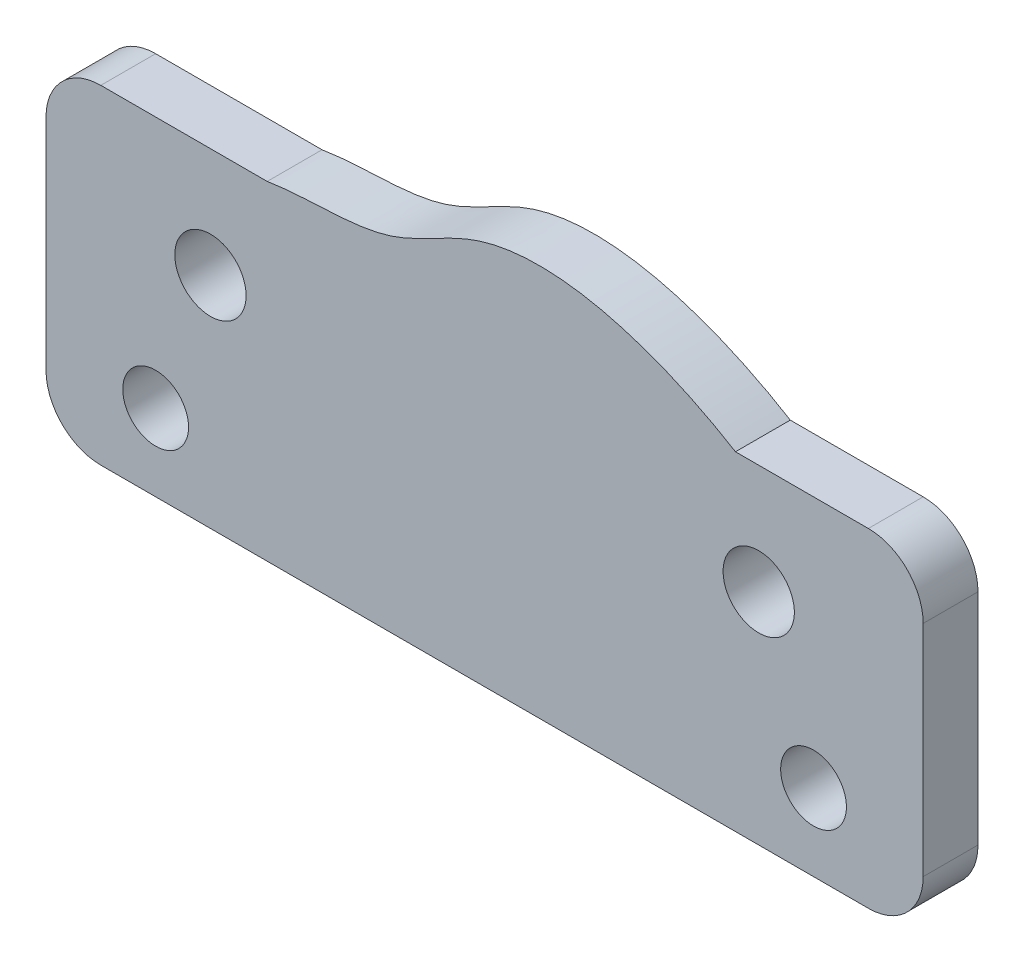
ISO-10303-21;
HEADER;
FILE_DESCRIPTION(('STEP AP214'),'2;1');
FILE_NAME('part.step','',(''),(''),'','','');
FILE_SCHEMA(('AUTOMOTIVE_DESIGN { 1 0 10303 214 1 1 1 1 }'));
ENDSEC;
DATA;
#1=APPLICATION_CONTEXT('core data for automotive mechanical design processes');
#2=APPLICATION_PROTOCOL_DEFINITION('international standard','automotive_design',2000,#1);
#3=PRODUCT_CONTEXT('',#1,'mechanical');
#4=PRODUCT('Part','Part','',(#3));
#5=PRODUCT_RELATED_PRODUCT_CATEGORY('part','',(#4));
#6=PRODUCT_DEFINITION_FORMATION('','',#4);
#7=PRODUCT_DEFINITION_CONTEXT('part definition',#1,'design');
#8=PRODUCT_DEFINITION('design','',#6,#7);
#9=PRODUCT_DEFINITION_SHAPE('','',#8);
#10=(LENGTH_UNIT() NAMED_UNIT(*) SI_UNIT(.MILLI.,.METRE.));
#11=(NAMED_UNIT(*) PLANE_ANGLE_UNIT() SI_UNIT($,.RADIAN.));
#12=(NAMED_UNIT(*) SI_UNIT($,.STERADIAN.) SOLID_ANGLE_UNIT());
#13=UNCERTAINTY_MEASURE_WITH_UNIT(LENGTH_MEASURE(1.E-05),#10,'distance_accuracy_value','');
#14=(GEOMETRIC_REPRESENTATION_CONTEXT(3) GLOBAL_UNCERTAINTY_ASSIGNED_CONTEXT((#13)) GLOBAL_UNIT_ASSIGNED_CONTEXT((#10,
#11,#12)) REPRESENTATION_CONTEXT('',''));
#15=CARTESIAN_POINT('',(0.,0.,0.));
#16=DIRECTION('',(0.,0.,1.));
#17=DIRECTION('',(1.,0.,0.));
#18=AXIS2_PLACEMENT_3D('',#15,#16,#17);
#19=CARTESIAN_POINT('',(0.,30.,5.));
#20=DIRECTION('',(0.,-1.,0.));
#21=DIRECTION('',(0.,0.,-1.));
#22=AXIS2_PLACEMENT_3D('',#19,#20,#21);
#23=PLANE('',#22);
#24=DIRECTION('',(-1.,0.,0.));
#25=VECTOR('',#24,1.);
#26=CARTESIAN_POINT('',(0.,30.,0.));
#27=LINE('',#26,#25);
#28=CARTESIAN_POINT('',(75.,30.,0.));
#29=VERTEX_POINT('',#28);
#30=CARTESIAN_POINT('',(62.8803686165401,30.,0.));
#31=VERTEX_POINT('',#30);
#32=EDGE_CURVE('E121',#29,#31,#27,.T.);
#33=ORIENTED_EDGE('',*,*,#32,.T.);
#34=DIRECTION('',(0.,0.,1.));
#35=VECTOR('',#34,1.);
#36=CARTESIAN_POINT('',(62.8803686165401,30.,0.));
#37=LINE('',#36,#35);
#38=CARTESIAN_POINT('',(62.8803686165401,30.,5.));
#39=VERTEX_POINT('',#38);
#40=EDGE_CURVE('E56',#31,#39,#37,.T.);
#41=ORIENTED_EDGE('',*,*,#40,.T.);
#42=DIRECTION('',(-1.,0.,0.));
#43=VECTOR('',#42,1.);
#44=CARTESIAN_POINT('',(0.,30.,5.));
#45=LINE('',#44,#43);
#46=CARTESIAN_POINT('',(75.,30.,5.));
#47=VERTEX_POINT('',#46);
#48=EDGE_CURVE('E215',#47,#39,#45,.T.);
#49=ORIENTED_EDGE('',*,*,#48,.F.);
#50=DIRECTION('',(0.,0.,-1.));
#51=VECTOR('',#50,1.);
#52=CARTESIAN_POINT('',(75.,30.,5.));
#53=LINE('',#52,#51);
#54=EDGE_CURVE('E204',#47,#29,#53,.T.);
#55=ORIENTED_EDGE('',*,*,#54,.T.);
#56=EDGE_LOOP('',(#33,#41,#49,#55));
#57=FACE_BOUND('',#56,.T.);
#58=ADVANCED_FACE('F33',(#57),#23,.F.);
#59=CARTESIAN_POINT('',(0.,0.,5.));
#60=DIRECTION('',(1.,0.,0.));
#61=DIRECTION('',(0.,0.,-1.));
#62=AXIS2_PLACEMENT_3D('',#59,#60,#61);
#63=PLANE('',#62);
#64=DIRECTION('',(0.,-1.,0.));
#65=VECTOR('',#64,1.);
#66=CARTESIAN_POINT('',(0.,0.,5.));
#67=LINE('',#66,#65);
#68=CARTESIAN_POINT('',(0.,25.,5.));
#69=VERTEX_POINT('',#68);
#70=CARTESIAN_POINT('',(0.,5.,5.));
#71=VERTEX_POINT('',#70);
#72=EDGE_CURVE('E205',#69,#71,#67,.T.);
#73=ORIENTED_EDGE('',*,*,#72,.F.);
#74=DIRECTION('',(0.,0.,-1.));
#75=VECTOR('',#74,1.);
#76=CARTESIAN_POINT('',(0.,25.,5.));
#77=LINE('',#76,#75);
#78=CARTESIAN_POINT('',(0.,25.,0.));
#79=VERTEX_POINT('',#78);
#80=EDGE_CURVE('E11',#69,#79,#77,.T.);
#81=ORIENTED_EDGE('',*,*,#80,.T.);
#82=DIRECTION('',(0.,-1.,0.));
#83=VECTOR('',#82,1.);
#84=CARTESIAN_POINT('',(0.,0.,0.));
#85=LINE('',#84,#83);
#86=CARTESIAN_POINT('',(0.,5.,0.));
#87=VERTEX_POINT('',#86);
#88=EDGE_CURVE('E244',#79,#87,#85,.T.);
#89=ORIENTED_EDGE('',*,*,#88,.T.);
#90=DIRECTION('',(0.,0.,-1.));
#91=VECTOR('',#90,1.);
#92=CARTESIAN_POINT('',(0.,5.,5.));
#93=LINE('',#92,#91);
#94=EDGE_CURVE('E41',#87,#71,#93,.F.);
#95=ORIENTED_EDGE('',*,*,#94,.T.);
#96=EDGE_LOOP('',(#73,#81,#89,#95));
#97=FACE_BOUND('',#96,.T.);
#98=ADVANCED_FACE('F179',(#97),#63,.F.);
#99=CARTESIAN_POINT('',(0.,0.,5.));
#100=DIRECTION('',(0.,1.,0.));
#101=DIRECTION('',(0.,0.,1.));
#102=AXIS2_PLACEMENT_3D('',#99,#100,#101);
#103=PLANE('',#102);
#104=DIRECTION('',(1.,0.,0.));
#105=VECTOR('',#104,1.);
#106=CARTESIAN_POINT('',(0.,0.,0.));
#107=LINE('',#106,#105);
#108=CARTESIAN_POINT('',(5.,0.,0.));
#109=VERTEX_POINT('',#108);
#110=CARTESIAN_POINT('',(75.,0.,0.));
#111=VERTEX_POINT('',#110);
#112=EDGE_CURVE('E252',#109,#111,#107,.T.);
#113=ORIENTED_EDGE('',*,*,#112,.T.);
#114=DIRECTION('',(0.,0.,-1.));
#115=VECTOR('',#114,1.);
#116=CARTESIAN_POINT('',(75.,0.,5.));
#117=LINE('',#116,#115);
#118=CARTESIAN_POINT('',(75.,0.,5.));
#119=VERTEX_POINT('',#118);
#120=EDGE_CURVE('E228',#111,#119,#117,.F.);
#121=ORIENTED_EDGE('',*,*,#120,.T.);
#122=DIRECTION('',(1.,0.,0.));
#123=VECTOR('',#122,1.);
#124=CARTESIAN_POINT('',(0.,0.,5.));
#125=LINE('',#124,#123);
#126=CARTESIAN_POINT('',(5.,0.,5.));
#127=VERTEX_POINT('',#126);
#128=EDGE_CURVE('E207',#127,#119,#125,.T.);
#129=ORIENTED_EDGE('',*,*,#128,.F.);
#130=DIRECTION('',(0.,0.,-1.));
#131=VECTOR('',#130,1.);
#132=CARTESIAN_POINT('',(5.,0.,5.));
#133=LINE('',#132,#131);
#134=EDGE_CURVE('E225',#127,#109,#133,.T.);
#135=ORIENTED_EDGE('',*,*,#134,.T.);
#136=EDGE_LOOP('',(#113,#121,#129,#135));
#137=FACE_BOUND('',#136,.T.);
#138=ADVANCED_FACE('F175',(#137),#103,.F.);
#139=CARTESIAN_POINT('',(80.,0.,5.));
#140=DIRECTION('',(-1.,0.,0.));
#141=DIRECTION('',(0.,0.,1.));
#142=AXIS2_PLACEMENT_3D('',#139,#140,#141);
#143=PLANE('',#142);
#144=DIRECTION('',(0.,1.,0.));
#145=VECTOR('',#144,1.);
#146=CARTESIAN_POINT('',(80.,0.,5.));
#147=LINE('',#146,#145);
#148=CARTESIAN_POINT('',(80.,5.,5.));
#149=VERTEX_POINT('',#148);
#150=CARTESIAN_POINT('',(80.,25.,5.));
#151=VERTEX_POINT('',#150);
#152=EDGE_CURVE('E259',#149,#151,#147,.T.);
#153=ORIENTED_EDGE('',*,*,#152,.F.);
#154=DIRECTION('',(0.,0.,-1.));
#155=VECTOR('',#154,1.);
#156=CARTESIAN_POINT('',(80.,5.,5.));
#157=LINE('',#156,#155);
#158=CARTESIAN_POINT('',(80.,5.,0.));
#159=VERTEX_POINT('',#158);
#160=EDGE_CURVE('E214',#149,#159,#157,.T.);
#161=ORIENTED_EDGE('',*,*,#160,.T.);
#162=DIRECTION('',(0.,1.,0.));
#163=VECTOR('',#162,1.);
#164=CARTESIAN_POINT('',(80.,0.,0.));
#165=LINE('',#164,#163);
#166=CARTESIAN_POINT('',(80.,25.,0.));
#167=VERTEX_POINT('',#166);
#168=EDGE_CURVE('E122',#159,#167,#165,.T.);
#169=ORIENTED_EDGE('',*,*,#168,.T.);
#170=DIRECTION('',(0.,0.,-1.));
#171=VECTOR('',#170,1.);
#172=CARTESIAN_POINT('',(80.,25.,5.));
#173=LINE('',#172,#171);
#174=EDGE_CURVE('E212',#167,#151,#173,.F.);
#175=ORIENTED_EDGE('',*,*,#174,.T.);
#176=EDGE_LOOP('',(#153,#161,#169,#175));
#177=FACE_BOUND('',#176,.T.);
#178=ADVANCED_FACE('F172',(#177),#143,.F.);
#179=CARTESIAN_POINT('',(20.1758539062469,30.,5.));
#180=VERTEX_POINT('',#179);
#181=CARTESIAN_POINT('',(5.,30.,5.));
#182=VERTEX_POINT('',#181);
#183=EDGE_CURVE('E48',#180,#182,#45,.T.);
#184=ORIENTED_EDGE('',*,*,#183,.F.);
#185=DIRECTION('',(0.,0.,1.));
#186=VECTOR('',#185,1.);
#187=CARTESIAN_POINT('',(20.1758539062469,30.,0.));
#188=LINE('',#187,#186);
#189=CARTESIAN_POINT('',(20.1758539062469,30.,0.));
#190=VERTEX_POINT('',#189);
#191=EDGE_CURVE('E124',#190,#180,#188,.T.);
#192=ORIENTED_EDGE('',*,*,#191,.F.);
#193=CARTESIAN_POINT('',(5.,30.,0.));
#194=VERTEX_POINT('',#193);
#195=EDGE_CURVE('E112',#190,#194,#27,.T.);
#196=ORIENTED_EDGE('',*,*,#195,.T.);
#197=DIRECTION('',(0.,0.,-1.));
#198=VECTOR('',#197,1.);
#199=CARTESIAN_POINT('',(5.,30.,5.));
#200=LINE('',#199,#198);
#201=EDGE_CURVE('E238',#194,#182,#200,.F.);
#202=ORIENTED_EDGE('',*,*,#201,.T.);
#203=EDGE_LOOP('',(#184,#192,#196,#202));
#204=FACE_BOUND('',#203,.T.);
#205=ADVANCED_FACE('F125',(#204),#23,.F.);
#206=CARTESIAN_POINT('',(0.,0.,5.));
#207=DIRECTION('',(0.,0.,-1.));
#208=DIRECTION('',(-1.,0.,0.));
#209=AXIS2_PLACEMENT_3D('',#206,#207,#208);
#210=PLANE('',#209);
#211=CARTESIAN_POINT('',(65.,20.,5.));
#212=DIRECTION('',(0.,0.,-1.));
#213=DIRECTION('',(-1.,0.,0.));
#214=AXIS2_PLACEMENT_3D('',#211,#212,#213);
#215=CIRCLE('',#214,3.25000000000001);
#216=CARTESIAN_POINT('',(61.75,20.,5.));
#217=VERTEX_POINT('',#216);
#218=EDGE_CURVE('E268',#217,#217,#215,.T.);
#219=ORIENTED_EDGE('',*,*,#218,.T.);
#220=EDGE_LOOP('',(#219));
#221=FACE_BOUND('',#220,.T.);
#222=CARTESIAN_POINT('',(10.,7.,5.));
#223=DIRECTION('',(0.,0.,-1.));
#224=DIRECTION('',(-1.,0.,0.));
#225=AXIS2_PLACEMENT_3D('',#222,#223,#224);
#226=CIRCLE('',#225,3.);
#227=CARTESIAN_POINT('',(7.,7.,5.));
#228=VERTEX_POINT('',#227);
#229=EDGE_CURVE('E271',#228,#228,#226,.T.);
#230=ORIENTED_EDGE('',*,*,#229,.T.);
#231=EDGE_LOOP('',(#230));
#232=FACE_BOUND('',#231,.T.);
#233=CARTESIAN_POINT('',(70.,7.,5.));
#234=DIRECTION('',(0.,0.,-1.));
#235=DIRECTION('',(-1.,0.,0.));
#236=AXIS2_PLACEMENT_3D('',#233,#234,#235);
#237=CIRCLE('',#236,3.00000000000001);
#238=CARTESIAN_POINT('',(67.,7.,5.));
#239=VERTEX_POINT('',#238);
#240=EDGE_CURVE('E274',#239,#239,#237,.T.);
#241=ORIENTED_EDGE('',*,*,#240,.T.);
#242=EDGE_LOOP('',(#241));
#243=FACE_BOUND('',#242,.T.);
#244=CARTESIAN_POINT('',(15.,20.,5.));
#245=DIRECTION('',(0.,0.,-1.));
#246=DIRECTION('',(-1.,0.,0.));
#247=AXIS2_PLACEMENT_3D('',#244,#245,#246);
#248=CIRCLE('',#247,3.25);
#249=CARTESIAN_POINT('',(11.75,20.,5.));
#250=VERTEX_POINT('',#249);
#251=EDGE_CURVE('E255',#250,#250,#248,.T.);
#252=ORIENTED_EDGE('',*,*,#251,.T.);
#253=EDGE_LOOP('',(#252));
#254=FACE_BOUND('',#253,.T.);
#255=ORIENTED_EDGE('',*,*,#128,.T.);
#256=CARTESIAN_POINT('',(75.,5.,5.));
#257=DIRECTION('',(0.,0.,-1.));
#258=DIRECTION('',(-1.,0.,0.));
#259=AXIS2_PLACEMENT_3D('',#256,#257,#258);
#260=CIRCLE('',#259,5.);
#261=EDGE_CURVE('E236',#119,#149,#260,.F.);
#262=ORIENTED_EDGE('',*,*,#261,.T.);
#263=ORIENTED_EDGE('',*,*,#152,.T.);
#264=CARTESIAN_POINT('',(75.,25.,5.));
#265=DIRECTION('',(0.,0.,-1.));
#266=DIRECTION('',(-1.,0.,0.));
#267=AXIS2_PLACEMENT_3D('',#264,#265,#266);
#268=CIRCLE('',#267,5.);
#269=EDGE_CURVE('E234',#151,#47,#268,.F.);
#270=ORIENTED_EDGE('',*,*,#269,.T.);
#271=ORIENTED_EDGE('',*,*,#48,.T.);
#272=CARTESIAN_POINT('',(62.8803686165401,30.,5.));
#273=CARTESIAN_POINT('',(56.248577833721,34.0441780208717,5.));
#274=CARTESIAN_POINT('',(43.3425479074571,38.7774745609646,5.));
#275=CARTESIAN_POINT('',(30.7539086225294,29.855151717904,5.));
#276=CARTESIAN_POINT('',(23.7568539582579,30.6156186983371,5.));
#277=CARTESIAN_POINT('',(20.1758539062469,30.,5.));
#278=B_SPLINE_CURVE_WITH_KNOTS('',3,(#272,#273,#274,#275,#276,#277),.UNSPECIFIED.,.F.,.F.,(4,1,
1,4),(0.,0.562893366810382,0.745092862069411,1.),.UNSPECIFIED.);
#279=EDGE_CURVE('E131',#39,#180,#278,.T.);
#280=ORIENTED_EDGE('',*,*,#279,.T.);
#281=ORIENTED_EDGE('',*,*,#183,.T.);
#282=CARTESIAN_POINT('',(5.,25.,5.));
#283=DIRECTION('',(0.,0.,-1.));
#284=DIRECTION('',(-1.,0.,0.));
#285=AXIS2_PLACEMENT_3D('',#282,#283,#284);
#286=CIRCLE('',#285,5.);
#287=EDGE_CURVE('E232',#182,#69,#286,.F.);
#288=ORIENTED_EDGE('',*,*,#287,.T.);
#289=ORIENTED_EDGE('',*,*,#72,.T.);
#290=CARTESIAN_POINT('',(5.,5.,5.));
#291=DIRECTION('',(0.,0.,-1.));
#292=DIRECTION('',(-1.,0.,0.));
#293=AXIS2_PLACEMENT_3D('',#290,#291,#292);
#294=CIRCLE('',#293,5.);
#295=EDGE_CURVE('E230',#71,#127,#294,.F.);
#296=ORIENTED_EDGE('',*,*,#295,.T.);
#297=EDGE_LOOP('',(#255,#262,#263,#270,#271,#280,#281,#288,#289,#296));
#298=FACE_BOUND('',#297,.T.);
#299=ADVANCED_FACE('F163',(#221,#232,#243,#254,#298),#210,.F.);
#300=CARTESIAN_POINT('',(0.,0.,0.));
#301=DIRECTION('',(0.,0.,-1.));
#302=DIRECTION('',(-1.,0.,0.));
#303=AXIS2_PLACEMENT_3D('',#300,#301,#302);
#304=PLANE('',#303);
#305=CARTESIAN_POINT('',(65.,20.,0.));
#306=DIRECTION('',(0.,0.,1.));
#307=DIRECTION('',(-1.,0.,0.));
#308=AXIS2_PLACEMENT_3D('',#305,#306,#307);
#309=CIRCLE('',#308,3.25000000000001);
#310=CARTESIAN_POINT('',(61.75,20.,0.));
#311=VERTEX_POINT('',#310);
#312=EDGE_CURVE('E277',#311,#311,#309,.T.);
#313=ORIENTED_EDGE('',*,*,#312,.T.);
#314=EDGE_LOOP('',(#313));
#315=FACE_BOUND('',#314,.T.);
#316=CARTESIAN_POINT('',(10.,7.,0.));
#317=DIRECTION('',(0.,0.,1.));
#318=DIRECTION('',(1.,0.,0.));
#319=AXIS2_PLACEMENT_3D('',#316,#317,#318);
#320=CIRCLE('',#319,3.);
#321=CARTESIAN_POINT('',(13.,7.,0.));
#322=VERTEX_POINT('',#321);
#323=EDGE_CURVE('E281',#322,#322,#320,.T.);
#324=ORIENTED_EDGE('',*,*,#323,.T.);
#325=EDGE_LOOP('',(#324));
#326=FACE_BOUND('',#325,.T.);
#327=CARTESIAN_POINT('',(70.,7.,0.));
#328=DIRECTION('',(0.,0.,1.));
#329=DIRECTION('',(-1.,0.,0.));
#330=AXIS2_PLACEMENT_3D('',#327,#328,#329);
#331=CIRCLE('',#330,3.00000000000001);
#332=CARTESIAN_POINT('',(67.,7.,0.));
#333=VERTEX_POINT('',#332);
#334=EDGE_CURVE('E278',#333,#333,#331,.T.);
#335=ORIENTED_EDGE('',*,*,#334,.T.);
#336=EDGE_LOOP('',(#335));
#337=FACE_BOUND('',#336,.T.);
#338=CARTESIAN_POINT('',(15.,20.,0.));
#339=DIRECTION('',(0.,0.,1.));
#340=DIRECTION('',(1.,0.,0.));
#341=AXIS2_PLACEMENT_3D('',#338,#339,#340);
#342=CIRCLE('',#341,3.25);
#343=CARTESIAN_POINT('',(18.25,20.,0.));
#344=VERTEX_POINT('',#343);
#345=EDGE_CURVE('E265',#344,#344,#342,.T.);
#346=ORIENTED_EDGE('',*,*,#345,.T.);
#347=EDGE_LOOP('',(#346));
#348=FACE_BOUND('',#347,.T.);
#349=ORIENTED_EDGE('',*,*,#168,.F.);
#350=CARTESIAN_POINT('',(75.,5.,0.));
#351=DIRECTION('',(0.,0.,-1.));
#352=DIRECTION('',(-1.,0.,0.));
#353=AXIS2_PLACEMENT_3D('',#350,#351,#352);
#354=CIRCLE('',#353,5.);
#355=EDGE_CURVE('E223',#159,#111,#354,.T.);
#356=ORIENTED_EDGE('',*,*,#355,.T.);
#357=ORIENTED_EDGE('',*,*,#112,.F.);
#358=CARTESIAN_POINT('',(5.,5.,0.));
#359=DIRECTION('',(0.,0.,-1.));
#360=DIRECTION('',(-1.,0.,0.));
#361=AXIS2_PLACEMENT_3D('',#358,#359,#360);
#362=CIRCLE('',#361,5.);
#363=EDGE_CURVE('E218',#109,#87,#362,.T.);
#364=ORIENTED_EDGE('',*,*,#363,.T.);
#365=ORIENTED_EDGE('',*,*,#88,.F.);
#366=CARTESIAN_POINT('',(5.,25.,0.));
#367=DIRECTION('',(0.,0.,-1.));
#368=DIRECTION('',(-1.,0.,0.));
#369=AXIS2_PLACEMENT_3D('',#366,#367,#368);
#370=CIRCLE('',#369,5.);
#371=EDGE_CURVE('E119',#79,#194,#370,.T.);
#372=ORIENTED_EDGE('',*,*,#371,.T.);
#373=ORIENTED_EDGE('',*,*,#195,.F.);
#374=CARTESIAN_POINT('',(62.8803686165401,30.,0.));
#375=CARTESIAN_POINT('',(56.248577833721,34.0441780208717,0.));
#376=CARTESIAN_POINT('',(43.3425479074571,38.7774745609646,0.));
#377=CARTESIAN_POINT('',(30.7539086225294,29.855151717904,0.));
#378=CARTESIAN_POINT('',(23.7568539582579,30.6156186983371,0.));
#379=CARTESIAN_POINT('',(20.1758539062469,30.,0.));
#380=B_SPLINE_CURVE_WITH_KNOTS('',3,(#374,#375,#376,#377,#378,#379),.UNSPECIFIED.,.F.,.F.,(4,1,
1,4),(0.,0.562893366810382,0.745092862069411,1.),.UNSPECIFIED.);
#381=EDGE_CURVE('E117',#31,#190,#380,.T.);
#382=ORIENTED_EDGE('',*,*,#381,.F.);
#383=ORIENTED_EDGE('',*,*,#32,.F.);
#384=CARTESIAN_POINT('',(75.,25.,0.));
#385=DIRECTION('',(0.,0.,-1.));
#386=DIRECTION('',(-1.,0.,0.));
#387=AXIS2_PLACEMENT_3D('',#384,#385,#386);
#388=CIRCLE('',#387,5.);
#389=EDGE_CURVE('E221',#29,#167,#388,.T.);
#390=ORIENTED_EDGE('',*,*,#389,.T.);
#391=EDGE_LOOP('',(#349,#356,#357,#364,#365,#372,#373,#382,#383,#390));
#392=FACE_BOUND('',#391,.T.);
#393=ADVANCED_FACE('F114',(#315,#326,#337,#348,#392),#304,.T.);
#394=CARTESIAN_POINT('',(15.,20.,0.));
#395=DIRECTION('',(0.,0.,1.));
#396=DIRECTION('',(1.,0.,0.));
#397=AXIS2_PLACEMENT_3D('',#394,#395,#396);
#398=CYLINDRICAL_SURFACE('',#397,3.25);
#399=ORIENTED_EDGE('',*,*,#345,.F.);
#400=EDGE_LOOP('',(#399));
#401=FACE_BOUND('',#400,.T.);
#402=ORIENTED_EDGE('',*,*,#251,.F.);
#403=EDGE_LOOP('',(#402));
#404=FACE_BOUND('',#403,.T.);
#405=ADVANCED_FACE('F158',(#401,#404),#398,.F.);
#406=CARTESIAN_POINT('',(70.,7.,0.));
#407=DIRECTION('',(0.,0.,1.));
#408=DIRECTION('',(1.,0.,0.));
#409=AXIS2_PLACEMENT_3D('',#406,#407,#408);
#410=CYLINDRICAL_SURFACE('',#409,3.00000000000001);
#411=ORIENTED_EDGE('',*,*,#334,.F.);
#412=EDGE_LOOP('',(#411));
#413=FACE_BOUND('',#412,.T.);
#414=ORIENTED_EDGE('',*,*,#240,.F.);
#415=EDGE_LOOP('',(#414));
#416=FACE_BOUND('',#415,.T.);
#417=ADVANCED_FACE('F154',(#413,#416),#410,.F.);
#418=CARTESIAN_POINT('',(10.,7.,0.));
#419=DIRECTION('',(0.,0.,1.));
#420=DIRECTION('',(1.,0.,0.));
#421=AXIS2_PLACEMENT_3D('',#418,#419,#420);
#422=CYLINDRICAL_SURFACE('',#421,3.);
#423=ORIENTED_EDGE('',*,*,#323,.F.);
#424=EDGE_LOOP('',(#423));
#425=FACE_BOUND('',#424,.T.);
#426=ORIENTED_EDGE('',*,*,#229,.F.);
#427=EDGE_LOOP('',(#426));
#428=FACE_BOUND('',#427,.T.);
#429=ADVANCED_FACE('F150',(#425,#428),#422,.F.);
#430=CARTESIAN_POINT('',(65.,20.,0.));
#431=DIRECTION('',(0.,0.,1.));
#432=DIRECTION('',(1.,0.,0.));
#433=AXIS2_PLACEMENT_3D('',#430,#431,#432);
#434=CYLINDRICAL_SURFACE('',#433,3.25000000000001);
#435=ORIENTED_EDGE('',*,*,#312,.F.);
#436=EDGE_LOOP('',(#435));
#437=FACE_BOUND('',#436,.T.);
#438=ORIENTED_EDGE('',*,*,#218,.F.);
#439=EDGE_LOOP('',(#438));
#440=FACE_BOUND('',#439,.T.);
#441=ADVANCED_FACE('F146',(#437,#440),#434,.F.);
#442=CARTESIAN_POINT('',(75.,5.,5.));
#443=DIRECTION('',(0.,0.,-1.));
#444=DIRECTION('',(-1.,0.,0.));
#445=AXIS2_PLACEMENT_3D('',#442,#443,#444);
#446=CYLINDRICAL_SURFACE('',#445,5.);
#447=ORIENTED_EDGE('',*,*,#261,.F.);
#448=ORIENTED_EDGE('',*,*,#120,.F.);
#449=ORIENTED_EDGE('',*,*,#355,.F.);
#450=ORIENTED_EDGE('',*,*,#160,.F.);
#451=EDGE_LOOP('',(#447,#448,#449,#450));
#452=FACE_BOUND('',#451,.T.);
#453=ADVANCED_FACE('F149',(#452),#446,.T.);
#454=CARTESIAN_POINT('',(75.,25.,5.));
#455=DIRECTION('',(0.,0.,-1.));
#456=DIRECTION('',(-1.,0.,0.));
#457=AXIS2_PLACEMENT_3D('',#454,#455,#456);
#458=CYLINDRICAL_SURFACE('',#457,5.);
#459=ORIENTED_EDGE('',*,*,#269,.F.);
#460=ORIENTED_EDGE('',*,*,#174,.F.);
#461=ORIENTED_EDGE('',*,*,#389,.F.);
#462=ORIENTED_EDGE('',*,*,#54,.F.);
#463=EDGE_LOOP('',(#459,#460,#461,#462));
#464=FACE_BOUND('',#463,.T.);
#465=ADVANCED_FACE('F186',(#464),#458,.T.);
#466=CARTESIAN_POINT('',(5.,25.,5.));
#467=DIRECTION('',(0.,0.,-1.));
#468=DIRECTION('',(-1.,0.,0.));
#469=AXIS2_PLACEMENT_3D('',#466,#467,#468);
#470=CYLINDRICAL_SURFACE('',#469,5.);
#471=ORIENTED_EDGE('',*,*,#287,.F.);
#472=ORIENTED_EDGE('',*,*,#201,.F.);
#473=ORIENTED_EDGE('',*,*,#371,.F.);
#474=ORIENTED_EDGE('',*,*,#80,.F.);
#475=EDGE_LOOP('',(#471,#472,#473,#474));
#476=FACE_BOUND('',#475,.T.);
#477=ADVANCED_FACE('F189',(#476),#470,.T.);
#478=CARTESIAN_POINT('',(5.,5.,5.));
#479=DIRECTION('',(0.,0.,-1.));
#480=DIRECTION('',(-1.,0.,0.));
#481=AXIS2_PLACEMENT_3D('',#478,#479,#480);
#482=CYLINDRICAL_SURFACE('',#481,5.);
#483=ORIENTED_EDGE('',*,*,#295,.F.);
#484=ORIENTED_EDGE('',*,*,#94,.F.);
#485=ORIENTED_EDGE('',*,*,#363,.F.);
#486=ORIENTED_EDGE('',*,*,#134,.F.);
#487=EDGE_LOOP('',(#483,#484,#485,#486));
#488=FACE_BOUND('',#487,.T.);
#489=ADVANCED_FACE('F35',(#488),#482,.T.);
#490=DIRECTION('',(0.,0.,1.));
#491=VECTOR('',#490,1.);
#492=SURFACE_OF_LINEAR_EXTRUSION('',#380,#491);
#493=ORIENTED_EDGE('',*,*,#279,.F.);
#494=ORIENTED_EDGE('',*,*,#40,.F.);
#495=ORIENTED_EDGE('',*,*,#381,.T.);
#496=ORIENTED_EDGE('',*,*,#191,.T.);
#497=EDGE_LOOP('',(#493,#494,#495,#496));
#498=FACE_BOUND('',#497,.T.);
#499=ADVANCED_FACE('F130',(#498),#492,.T.);
#500=CLOSED_SHELL('',(#58,#98,#138,#178,#205,#299,#393,#405,#417,#429,#441,#453,#465,#477,#489,#499));
#501=MANIFOLD_SOLID_BREP('B2',#500);
#502=ADVANCED_BREP_SHAPE_REPRESENTATION('',(#18,#501),#14);
#503=SHAPE_DEFINITION_REPRESENTATION(#9,#502);
ENDSEC;
END-ISO-10303-21;
